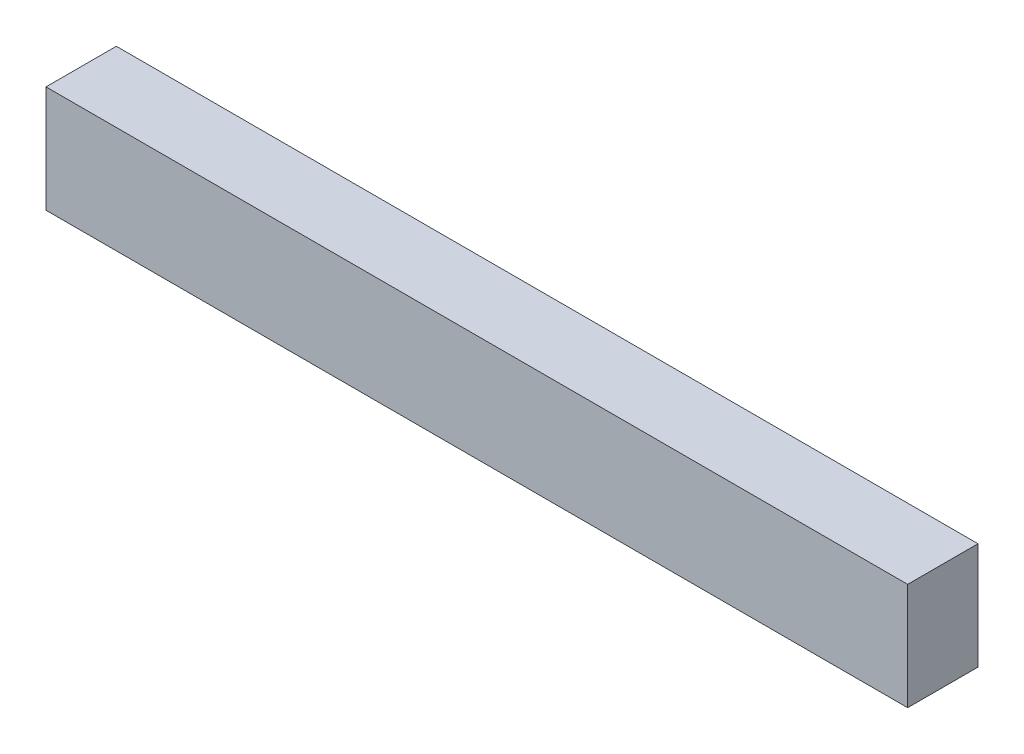
ISO-10303-21;
HEADER;
FILE_DESCRIPTION(('STEP AP214'),'2;1');
FILE_NAME('part.step','',(''),(''),'','','');
FILE_SCHEMA(('AUTOMOTIVE_DESIGN { 1 0 10303 214 1 1 1 1 }'));
ENDSEC;
DATA;
#1=APPLICATION_CONTEXT('core data for automotive mechanical design processes');
#2=APPLICATION_PROTOCOL_DEFINITION('international standard','automotive_design',2000,#1);
#3=PRODUCT_CONTEXT('',#1,'mechanical');
#4=PRODUCT('Part','Part','',(#3));
#5=PRODUCT_RELATED_PRODUCT_CATEGORY('part','',(#4));
#6=PRODUCT_DEFINITION_FORMATION('','',#4);
#7=PRODUCT_DEFINITION_CONTEXT('part definition',#1,'design');
#8=PRODUCT_DEFINITION('design','',#6,#7);
#9=PRODUCT_DEFINITION_SHAPE('','',#8);
#10=(LENGTH_UNIT() NAMED_UNIT(*) SI_UNIT(.MILLI.,.METRE.));
#11=(NAMED_UNIT(*) PLANE_ANGLE_UNIT() SI_UNIT($,.RADIAN.));
#12=(NAMED_UNIT(*) SI_UNIT($,.STERADIAN.) SOLID_ANGLE_UNIT());
#13=UNCERTAINTY_MEASURE_WITH_UNIT(LENGTH_MEASURE(1.E-05),#10,'distance_accuracy_value','');
#14=(GEOMETRIC_REPRESENTATION_CONTEXT(3) GLOBAL_UNCERTAINTY_ASSIGNED_CONTEXT((#13)) GLOBAL_UNIT_ASSIGNED_CONTEXT((#10,
#11,#12)) REPRESENTATION_CONTEXT('',''));
#15=CARTESIAN_POINT('',(0.,0.,0.));
#16=DIRECTION('',(0.,0.,1.));
#17=DIRECTION('',(1.,0.,0.));
#18=AXIS2_PLACEMENT_3D('',#15,#16,#17);
#19=CARTESIAN_POINT('',(0.,0.,31.9999999999998));
#20=DIRECTION('',(0.,0.,-1.));
#21=DIRECTION('',(-1.,0.,0.));
#22=AXIS2_PLACEMENT_3D('',#19,#20,#21);
#23=PLANE('',#22);
#24=DIRECTION('',(0.,1.,0.));
#25=VECTOR('',#24,1.);
#26=CARTESIAN_POINT('',(240.3,26.2173022950043,31.9999999999998));
#27=LINE('',#26,#25);
#28=CARTESIAN_POINT('',(240.3,20.1407400337701,31.9999999999998));
#29=VERTEX_POINT('',#28);
#30=CARTESIAN_POINT('',(240.3,26.2173022950043,31.9999999999998));
#31=VERTEX_POINT('',#30);
#32=EDGE_CURVE('E93',#29,#31,#27,.T.);
#33=ORIENTED_EDGE('',*,*,#32,.T.);
#34=DIRECTION('',(-1.,0.,0.));
#35=VECTOR('',#34,1.);
#36=CARTESIAN_POINT('',(240.3,26.2173022950043,31.9999999999998));
#37=LINE('',#36,#35);
#38=CARTESIAN_POINT('',(191.3,26.2173022950043,31.9999999999998));
#39=VERTEX_POINT('',#38);
#40=EDGE_CURVE('E71',#31,#39,#37,.T.);
#41=ORIENTED_EDGE('',*,*,#40,.T.);
#42=DIRECTION('',(0.,-1.,0.));
#43=VECTOR('',#42,1.);
#44=CARTESIAN_POINT('',(191.3,26.2173022950043,31.9999999999998));
#45=LINE('',#44,#43);
#46=CARTESIAN_POINT('',(191.3,20.1407400337701,31.9999999999998));
#47=VERTEX_POINT('',#46);
#48=EDGE_CURVE('E98',#39,#47,#45,.T.);
#49=ORIENTED_EDGE('',*,*,#48,.T.);
#50=DIRECTION('',(1.,0.,0.));
#51=VECTOR('',#50,1.);
#52=CARTESIAN_POINT('',(240.3,20.1407400337701,31.9999999999998));
#53=LINE('',#52,#51);
#54=EDGE_CURVE('E92',#47,#29,#53,.T.);
#55=ORIENTED_EDGE('',*,*,#54,.T.);
#56=EDGE_LOOP('',(#33,#41,#49,#55));
#57=FACE_BOUND('',#56,.T.);
#58=ADVANCED_FACE('F35',(#57),#23,.F.);
#59=CARTESIAN_POINT('',(240.3,14.064177772536,18.));
#60=DIRECTION('',(1.,0.,0.));
#61=DIRECTION('',(0.,0.,-1.));
#62=AXIS2_PLACEMENT_3D('',#59,#60,#61);
#63=PLANE('',#62);
#64=DIRECTION('',(0.,1.,0.));
#65=VECTOR('',#64,1.);
#66=CARTESIAN_POINT('',(240.3,20.1407400337701,27.9999999999998));
#67=LINE('',#66,#65);
#68=CARTESIAN_POINT('',(240.3,20.1407400337701,27.9999999999998));
#69=VERTEX_POINT('',#68);
#70=CARTESIAN_POINT('',(240.3,26.2173022950025,28.));
#71=VERTEX_POINT('',#70);
#72=EDGE_CURVE('E88',#69,#71,#67,.T.);
#73=ORIENTED_EDGE('',*,*,#72,.T.);
#74=DIRECTION('',(0.,0.,-1.));
#75=VECTOR('',#74,1.);
#76=CARTESIAN_POINT('',(240.3,26.2173022950043,31.9999999999998));
#77=LINE('',#76,#75);
#78=EDGE_CURVE('E102',#31,#71,#77,.T.);
#79=ORIENTED_EDGE('',*,*,#78,.F.);
#80=ORIENTED_EDGE('',*,*,#32,.F.);
#81=DIRECTION('',(0.,0.,-1.));
#82=VECTOR('',#81,1.);
#83=CARTESIAN_POINT('',(240.3,20.1407400337701,31.9999999999998));
#84=LINE('',#83,#82);
#85=EDGE_CURVE('E83',#29,#69,#84,.T.);
#86=ORIENTED_EDGE('',*,*,#85,.T.);
#87=EDGE_LOOP('',(#73,#79,#80,#86));
#88=FACE_BOUND('',#87,.T.);
#89=ADVANCED_FACE('F37',(#88),#63,.T.);
#90=CARTESIAN_POINT('',(0.,0.,27.9999999999998));
#91=DIRECTION('',(0.,0.,-1.));
#92=DIRECTION('',(-1.,0.,0.));
#93=AXIS2_PLACEMENT_3D('',#90,#91,#92);
#94=PLANE('',#93);
#95=ORIENTED_EDGE('',*,*,#72,.F.);
#96=DIRECTION('',(1.,0.,0.));
#97=VECTOR('',#96,1.);
#98=CARTESIAN_POINT('',(240.3,20.1407400337701,27.9999999999998));
#99=LINE('',#98,#97);
#100=CARTESIAN_POINT('',(191.3,20.1407400337701,27.9999999999998));
#101=VERTEX_POINT('',#100);
#102=EDGE_CURVE('E39',#101,#69,#99,.T.);
#103=ORIENTED_EDGE('',*,*,#102,.F.);
#104=DIRECTION('',(0.,-1.,0.));
#105=VECTOR('',#104,1.);
#106=CARTESIAN_POINT('',(191.3,26.2173022950043,27.9999999999998));
#107=LINE('',#106,#105);
#108=CARTESIAN_POINT('',(191.3,26.2173022950043,27.9999999999998));
#109=VERTEX_POINT('',#108);
#110=EDGE_CURVE('E45',#109,#101,#107,.T.);
#111=ORIENTED_EDGE('',*,*,#110,.F.);
#112=DIRECTION('',(-1.,0.,0.));
#113=VECTOR('',#112,1.);
#114=CARTESIAN_POINT('',(240.3,26.2173022950025,28.));
#115=LINE('',#114,#113);
#116=EDGE_CURVE('E54',#71,#109,#115,.T.);
#117=ORIENTED_EDGE('',*,*,#116,.F.);
#118=EDGE_LOOP('',(#95,#103,#111,#117));
#119=FACE_BOUND('',#118,.T.);
#120=ADVANCED_FACE('F89',(#119),#94,.T.);
#121=CARTESIAN_POINT('',(240.3,20.1407400337701,31.9999999999998));
#122=DIRECTION('',(0.,1.,0.));
#123=DIRECTION('',(0.,0.,1.));
#124=AXIS2_PLACEMENT_3D('',#121,#122,#123);
#125=PLANE('',#124);
#126=ORIENTED_EDGE('',*,*,#102,.T.);
#127=ORIENTED_EDGE('',*,*,#85,.F.);
#128=ORIENTED_EDGE('',*,*,#54,.F.);
#129=DIRECTION('',(0.,0.,-1.));
#130=VECTOR('',#129,1.);
#131=CARTESIAN_POINT('',(191.3,20.1407400337701,31.9999999999998));
#132=LINE('',#131,#130);
#133=EDGE_CURVE('E86',#47,#101,#132,.T.);
#134=ORIENTED_EDGE('',*,*,#133,.T.);
#135=EDGE_LOOP('',(#126,#127,#128,#134));
#136=FACE_BOUND('',#135,.T.);
#137=ADVANCED_FACE('F80',(#136),#125,.F.);
#138=CARTESIAN_POINT('',(240.3,26.2173022950043,31.9999999999998));
#139=DIRECTION('',(0.,-1.,0.));
#140=DIRECTION('',(0.,0.,-1.));
#141=AXIS2_PLACEMENT_3D('',#138,#139,#140);
#142=PLANE('',#141);
#143=ORIENTED_EDGE('',*,*,#116,.T.);
#144=DIRECTION('',(0.,0.,-1.));
#145=VECTOR('',#144,1.);
#146=CARTESIAN_POINT('',(191.3,26.2173022950043,31.9999999999998));
#147=LINE('',#146,#145);
#148=EDGE_CURVE('E11',#39,#109,#147,.T.);
#149=ORIENTED_EDGE('',*,*,#148,.F.);
#150=ORIENTED_EDGE('',*,*,#40,.F.);
#151=ORIENTED_EDGE('',*,*,#78,.T.);
#152=EDGE_LOOP('',(#143,#149,#150,#151));
#153=FACE_BOUND('',#152,.T.);
#154=ADVANCED_FACE('F106',(#153),#142,.F.);
#155=CARTESIAN_POINT('',(191.3,14.064177772536,18.));
#156=DIRECTION('',(-1.,0.,0.));
#157=DIRECTION('',(0.,-1.,0.));
#158=AXIS2_PLACEMENT_3D('',#155,#156,#157);
#159=PLANE('',#158);
#160=ORIENTED_EDGE('',*,*,#110,.T.);
#161=ORIENTED_EDGE('',*,*,#133,.F.);
#162=ORIENTED_EDGE('',*,*,#48,.F.);
#163=ORIENTED_EDGE('',*,*,#148,.T.);
#164=EDGE_LOOP('',(#160,#161,#162,#163));
#165=FACE_BOUND('',#164,.T.);
#166=ADVANCED_FACE('F108',(#165),#159,.T.);
#167=CLOSED_SHELL('',(#58,#89,#120,#137,#154,#166));
#168=MANIFOLD_SOLID_BREP('B2',#167);
#169=ADVANCED_BREP_SHAPE_REPRESENTATION('',(#18,#168),#14);
#170=SHAPE_DEFINITION_REPRESENTATION(#9,#169);
ENDSEC;
END-ISO-10303-21;
